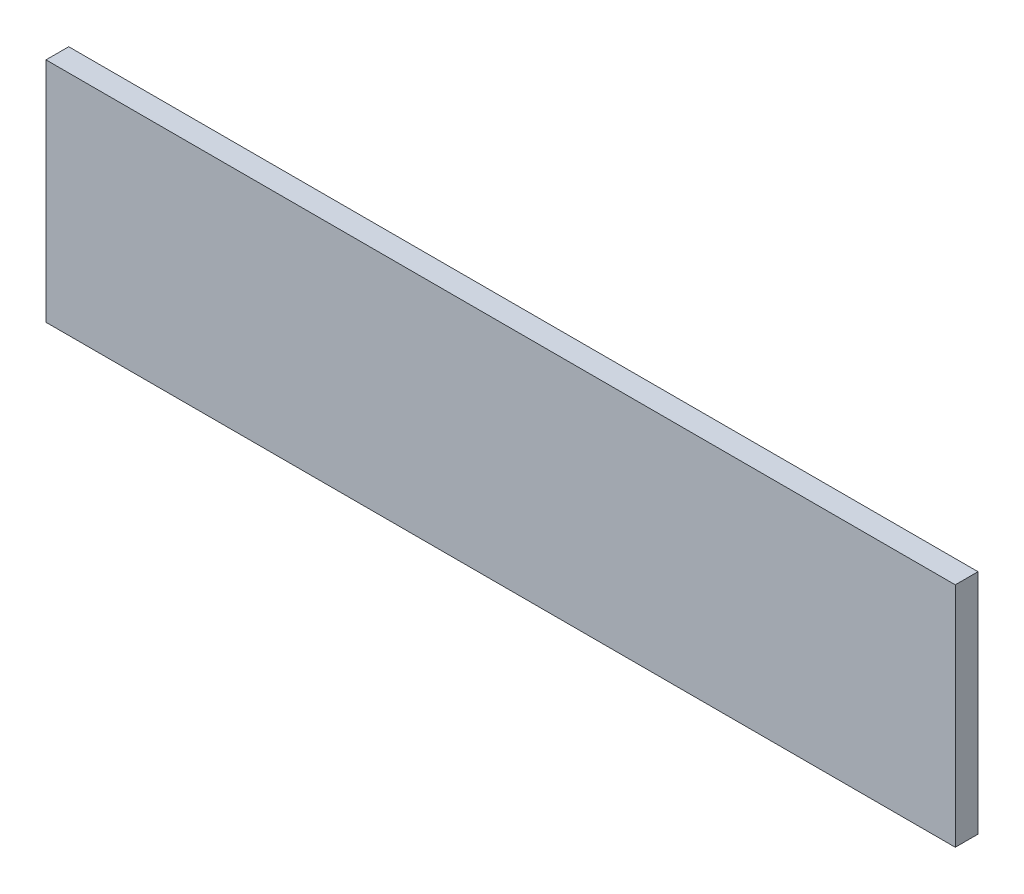
ISO-10303-21;
HEADER;
FILE_DESCRIPTION(('STEP AP214'),'2;1');
FILE_NAME('part.step','',(''),(''),'','','');
FILE_SCHEMA(('AUTOMOTIVE_DESIGN { 1 0 10303 214 1 1 1 1 }'));
ENDSEC;
DATA;
#1=APPLICATION_CONTEXT('core data for automotive mechanical design processes');
#2=APPLICATION_PROTOCOL_DEFINITION('international standard','automotive_design',2000,#1);
#3=PRODUCT_CONTEXT('',#1,'mechanical');
#4=PRODUCT('Part','Part','',(#3));
#5=PRODUCT_RELATED_PRODUCT_CATEGORY('part','',(#4));
#6=PRODUCT_DEFINITION_FORMATION('','',#4);
#7=PRODUCT_DEFINITION_CONTEXT('part definition',#1,'design');
#8=PRODUCT_DEFINITION('design','',#6,#7);
#9=PRODUCT_DEFINITION_SHAPE('','',#8);
#10=(LENGTH_UNIT() NAMED_UNIT(*) SI_UNIT(.MILLI.,.METRE.));
#11=(NAMED_UNIT(*) PLANE_ANGLE_UNIT() SI_UNIT($,.RADIAN.));
#12=(NAMED_UNIT(*) SI_UNIT($,.STERADIAN.) SOLID_ANGLE_UNIT());
#13=UNCERTAINTY_MEASURE_WITH_UNIT(LENGTH_MEASURE(1.E-05),#10,'distance_accuracy_value','');
#14=(GEOMETRIC_REPRESENTATION_CONTEXT(3) GLOBAL_UNCERTAINTY_ASSIGNED_CONTEXT((#13)) GLOBAL_UNIT_ASSIGNED_CONTEXT((#10,
#11,#12)) REPRESENTATION_CONTEXT('',''));
#15=CARTESIAN_POINT('',(0.,0.,0.));
#16=DIRECTION('',(0.,0.,1.));
#17=DIRECTION('',(1.,0.,0.));
#18=AXIS2_PLACEMENT_3D('',#15,#16,#17);
#19=CARTESIAN_POINT('',(100.,25.,5.));
#20=DIRECTION('',(-1.,0.,0.));
#21=DIRECTION('',(0.,-1.,0.));
#22=AXIS2_PLACEMENT_3D('',#19,#20,#21);
#23=PLANE('',#22);
#24=DIRECTION('',(0.,1.,0.));
#25=VECTOR('',#24,1.);
#26=CARTESIAN_POINT('',(100.,25.,0.));
#27=LINE('',#26,#25);
#28=CARTESIAN_POINT('',(100.,-25.,0.));
#29=VERTEX_POINT('',#28);
#30=CARTESIAN_POINT('',(100.,25.,0.));
#31=VERTEX_POINT('',#30);
#32=EDGE_CURVE('E98',#29,#31,#27,.T.);
#33=ORIENTED_EDGE('',*,*,#32,.T.);
#34=DIRECTION('',(0.,0.,-1.));
#35=VECTOR('',#34,1.);
#36=CARTESIAN_POINT('',(100.,25.,5.));
#37=LINE('',#36,#35);
#38=CARTESIAN_POINT('',(100.,25.,5.));
#39=VERTEX_POINT('',#38);
#40=EDGE_CURVE('E11',#39,#31,#37,.T.);
#41=ORIENTED_EDGE('',*,*,#40,.F.);
#42=DIRECTION('',(0.,1.,0.));
#43=VECTOR('',#42,1.);
#44=CARTESIAN_POINT('',(100.,25.,5.));
#45=LINE('',#44,#43);
#46=CARTESIAN_POINT('',(100.,-25.,5.));
#47=VERTEX_POINT('',#46);
#48=EDGE_CURVE('E86',#47,#39,#45,.T.);
#49=ORIENTED_EDGE('',*,*,#48,.F.);
#50=DIRECTION('',(0.,0.,-1.));
#51=VECTOR('',#50,1.);
#52=CARTESIAN_POINT('',(100.,-25.,5.));
#53=LINE('',#52,#51);
#54=EDGE_CURVE('E94',#47,#29,#53,.T.);
#55=ORIENTED_EDGE('',*,*,#54,.T.);
#56=EDGE_LOOP('',(#33,#41,#49,#55));
#57=FACE_BOUND('',#56,.T.);
#58=ADVANCED_FACE('F35',(#57),#23,.F.);
#59=CARTESIAN_POINT('',(-100.,25.,5.));
#60=DIRECTION('',(0.,-1.,0.));
#61=DIRECTION('',(0.,0.,-1.));
#62=AXIS2_PLACEMENT_3D('',#59,#60,#61);
#63=PLANE('',#62);
#64=DIRECTION('',(-1.,0.,0.));
#65=VECTOR('',#64,1.);
#66=CARTESIAN_POINT('',(-100.,25.,0.));
#67=LINE('',#66,#65);
#68=CARTESIAN_POINT('',(-100.,25.,0.));
#69=VERTEX_POINT('',#68);
#70=EDGE_CURVE('E90',#31,#69,#67,.T.);
#71=ORIENTED_EDGE('',*,*,#70,.T.);
#72=DIRECTION('',(0.,0.,-1.));
#73=VECTOR('',#72,1.);
#74=CARTESIAN_POINT('',(-100.,25.,5.));
#75=LINE('',#74,#73);
#76=CARTESIAN_POINT('',(-100.,25.,5.));
#77=VERTEX_POINT('',#76);
#78=EDGE_CURVE('E43',#77,#69,#75,.T.);
#79=ORIENTED_EDGE('',*,*,#78,.F.);
#80=DIRECTION('',(-1.,0.,0.));
#81=VECTOR('',#80,1.);
#82=CARTESIAN_POINT('',(-100.,25.,5.));
#83=LINE('',#82,#81);
#84=EDGE_CURVE('E81',#39,#77,#83,.T.);
#85=ORIENTED_EDGE('',*,*,#84,.F.);
#86=ORIENTED_EDGE('',*,*,#40,.T.);
#87=EDGE_LOOP('',(#71,#79,#85,#86));
#88=FACE_BOUND('',#87,.T.);
#89=ADVANCED_FACE('F89',(#88),#63,.F.);
#90=CARTESIAN_POINT('',(-100.,25.,5.));
#91=DIRECTION('',(1.,0.,0.));
#92=DIRECTION('',(0.,0.,-1.));
#93=AXIS2_PLACEMENT_3D('',#90,#91,#92);
#94=PLANE('',#93);
#95=DIRECTION('',(0.,-1.,0.));
#96=VECTOR('',#95,1.);
#97=CARTESIAN_POINT('',(-100.,25.,0.));
#98=LINE('',#97,#96);
#99=CARTESIAN_POINT('',(-100.,-25.,0.));
#100=VERTEX_POINT('',#99);
#101=EDGE_CURVE('E68',#69,#100,#98,.T.);
#102=ORIENTED_EDGE('',*,*,#101,.T.);
#103=DIRECTION('',(0.,0.,-1.));
#104=VECTOR('',#103,1.);
#105=CARTESIAN_POINT('',(-100.,-25.,5.));
#106=LINE('',#105,#104);
#107=CARTESIAN_POINT('',(-100.,-25.,5.));
#108=VERTEX_POINT('',#107);
#109=EDGE_CURVE('E91',#108,#100,#106,.T.);
#110=ORIENTED_EDGE('',*,*,#109,.F.);
#111=DIRECTION('',(0.,-1.,0.));
#112=VECTOR('',#111,1.);
#113=CARTESIAN_POINT('',(-100.,25.,5.));
#114=LINE('',#113,#112);
#115=EDGE_CURVE('E84',#77,#108,#114,.T.);
#116=ORIENTED_EDGE('',*,*,#115,.F.);
#117=ORIENTED_EDGE('',*,*,#78,.T.);
#118=EDGE_LOOP('',(#102,#110,#116,#117));
#119=FACE_BOUND('',#118,.T.);
#120=ADVANCED_FACE('F92',(#119),#94,.F.);
#121=CARTESIAN_POINT('',(-100.,-25.,5.));
#122=DIRECTION('',(0.,1.,0.));
#123=DIRECTION('',(0.,0.,1.));
#124=AXIS2_PLACEMENT_3D('',#121,#122,#123);
#125=PLANE('',#124);
#126=DIRECTION('',(1.,0.,0.));
#127=VECTOR('',#126,1.);
#128=CARTESIAN_POINT('',(-100.,-25.,0.));
#129=LINE('',#128,#127);
#130=EDGE_CURVE('E74',#100,#29,#129,.T.);
#131=ORIENTED_EDGE('',*,*,#130,.T.);
#132=ORIENTED_EDGE('',*,*,#54,.F.);
#133=DIRECTION('',(1.,0.,0.));
#134=VECTOR('',#133,1.);
#135=CARTESIAN_POINT('',(-100.,-25.,5.));
#136=LINE('',#135,#134);
#137=EDGE_CURVE('E51',#108,#47,#136,.T.);
#138=ORIENTED_EDGE('',*,*,#137,.F.);
#139=ORIENTED_EDGE('',*,*,#109,.T.);
#140=EDGE_LOOP('',(#131,#132,#138,#139));
#141=FACE_BOUND('',#140,.T.);
#142=ADVANCED_FACE('F105',(#141),#125,.F.);
#143=CARTESIAN_POINT('',(0.,0.,5.));
#144=DIRECTION('',(0.,0.,1.));
#145=DIRECTION('',(1.,0.,0.));
#146=AXIS2_PLACEMENT_3D('',#143,#144,#145);
#147=PLANE('',#146);
#148=ORIENTED_EDGE('',*,*,#48,.T.);
#149=ORIENTED_EDGE('',*,*,#84,.T.);
#150=ORIENTED_EDGE('',*,*,#115,.T.);
#151=ORIENTED_EDGE('',*,*,#137,.T.);
#152=EDGE_LOOP('',(#148,#149,#150,#151));
#153=FACE_BOUND('',#152,.T.);
#154=ADVANCED_FACE('F82',(#153),#147,.T.);
#155=CARTESIAN_POINT('',(0.,0.,0.));
#156=DIRECTION('',(0.,0.,1.));
#157=DIRECTION('',(1.,0.,0.));
#158=AXIS2_PLACEMENT_3D('',#155,#156,#157);
#159=PLANE('',#158);
#160=ORIENTED_EDGE('',*,*,#32,.F.);
#161=ORIENTED_EDGE('',*,*,#130,.F.);
#162=ORIENTED_EDGE('',*,*,#101,.F.);
#163=ORIENTED_EDGE('',*,*,#70,.F.);
#164=EDGE_LOOP('',(#160,#161,#162,#163));
#165=FACE_BOUND('',#164,.T.);
#166=ADVANCED_FACE('F108',(#165),#159,.F.);
#167=CLOSED_SHELL('',(#58,#89,#120,#142,#154,#166));
#168=MANIFOLD_SOLID_BREP('B2',#167);
#169=ADVANCED_BREP_SHAPE_REPRESENTATION('',(#18,#168),#14);
#170=SHAPE_DEFINITION_REPRESENTATION(#9,#169);
ENDSEC;
END-ISO-10303-21;
